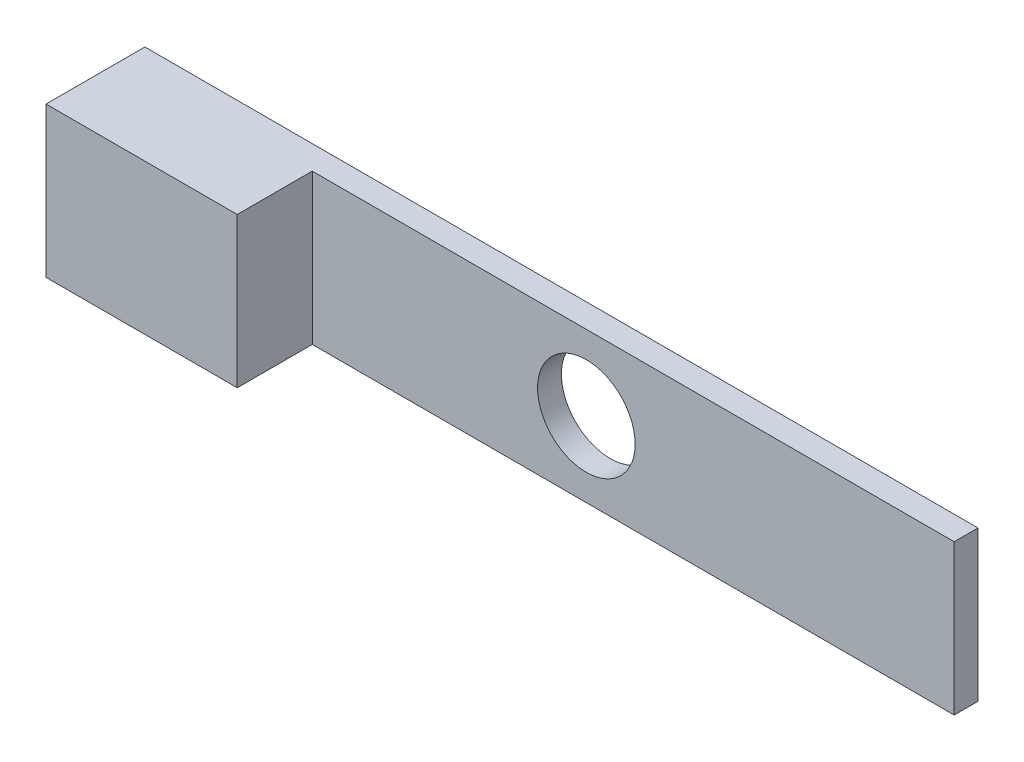
ISO-10303-21;
HEADER;
FILE_DESCRIPTION(('STEP AP214'),'2;1');
FILE_NAME('part.step','',(''),(''),'','','');
FILE_SCHEMA(('AUTOMOTIVE_DESIGN { 1 0 10303 214 1 1 1 1 }'));
ENDSEC;
DATA;
#1=APPLICATION_CONTEXT('core data for automotive mechanical design processes');
#2=APPLICATION_PROTOCOL_DEFINITION('international standard','automotive_design',2000,#1);
#3=PRODUCT_CONTEXT('',#1,'mechanical');
#4=PRODUCT('Part','Part','',(#3));
#5=PRODUCT_RELATED_PRODUCT_CATEGORY('part','',(#4));
#6=PRODUCT_DEFINITION_FORMATION('','',#4);
#7=PRODUCT_DEFINITION_CONTEXT('part definition',#1,'design');
#8=PRODUCT_DEFINITION('design','',#6,#7);
#9=PRODUCT_DEFINITION_SHAPE('','',#8);
#10=(LENGTH_UNIT() NAMED_UNIT(*) SI_UNIT(.MILLI.,.METRE.));
#11=(NAMED_UNIT(*) PLANE_ANGLE_UNIT() SI_UNIT($,.RADIAN.));
#12=(NAMED_UNIT(*) SI_UNIT($,.STERADIAN.) SOLID_ANGLE_UNIT());
#13=UNCERTAINTY_MEASURE_WITH_UNIT(LENGTH_MEASURE(1.E-05),#10,'distance_accuracy_value','');
#14=(GEOMETRIC_REPRESENTATION_CONTEXT(3) GLOBAL_UNCERTAINTY_ASSIGNED_CONTEXT((#13)) GLOBAL_UNIT_ASSIGNED_CONTEXT((#10,
#11,#12)) REPRESENTATION_CONTEXT('',''));
#15=CARTESIAN_POINT('',(0.,0.,0.));
#16=DIRECTION('',(0.,0.,1.));
#17=DIRECTION('',(1.,0.,0.));
#18=AXIS2_PLACEMENT_3D('',#15,#16,#17);
#19=CARTESIAN_POINT('',(-112.538661647429,0.,1.5875));
#20=DIRECTION('',(-1.,0.,0.));
#21=DIRECTION('',(0.,0.,1.));
#22=AXIS2_PLACEMENT_3D('',#19,#20,#21);
#23=PLANE('',#22);
#24=DIRECTION('',(0.,1.,0.));
#25=VECTOR('',#24,1.);
#26=CARTESIAN_POINT('',(-112.538661647429,0.,-1.5875));
#27=LINE('',#26,#25);
#28=CARTESIAN_POINT('',(-112.538661647429,-10.,-1.5875));
#29=VERTEX_POINT('',#28);
#30=CARTESIAN_POINT('',(-112.538661647429,10.,-1.5875));
#31=VERTEX_POINT('',#30);
#32=EDGE_CURVE('E87',#29,#31,#27,.T.);
#33=ORIENTED_EDGE('',*,*,#32,.F.);
#34=DIRECTION('',(0.,0.,-1.));
#35=VECTOR('',#34,1.);
#36=CARTESIAN_POINT('',(-112.538661647429,-10.,1.5875));
#37=LINE('',#36,#35);
#38=CARTESIAN_POINT('',(-112.538661647429,-10.,11.5875));
#39=VERTEX_POINT('',#38);
#40=EDGE_CURVE('E11',#39,#29,#37,.T.);
#41=ORIENTED_EDGE('',*,*,#40,.F.);
#42=DIRECTION('',(0.,-1.,0.));
#43=VECTOR('',#42,1.);
#44=CARTESIAN_POINT('',(-112.538661647429,10.,11.5875));
#45=LINE('',#44,#43);
#46=CARTESIAN_POINT('',(-112.538661647429,10.,11.5875));
#47=VERTEX_POINT('',#46);
#48=EDGE_CURVE('E89',#47,#39,#45,.T.);
#49=ORIENTED_EDGE('',*,*,#48,.F.);
#50=DIRECTION('',(0.,0.,-1.));
#51=VECTOR('',#50,1.);
#52=CARTESIAN_POINT('',(-112.538661647429,10.,1.5875));
#53=LINE('',#52,#51);
#54=EDGE_CURVE('E84',#47,#31,#53,.T.);
#55=ORIENTED_EDGE('',*,*,#54,.T.);
#56=EDGE_LOOP('',(#33,#41,#49,#55));
#57=FACE_BOUND('',#56,.T.);
#58=ADVANCED_FACE('F43',(#57),#23,.T.);
#59=CARTESIAN_POINT('',(0.,-10.,1.5875));
#60=DIRECTION('',(0.,1.,0.));
#61=DIRECTION('',(0.,0.,1.));
#62=AXIS2_PLACEMENT_3D('',#59,#60,#61);
#63=PLANE('',#62);
#64=DIRECTION('',(1.,0.,0.));
#65=VECTOR('',#64,1.);
#66=CARTESIAN_POINT('',(0.,-10.,-1.5875));
#67=LINE('',#66,#65);
#68=CARTESIAN_POINT('',(-1.52509969367723,-10.,-1.5875));
#69=VERTEX_POINT('',#68);
#70=EDGE_CURVE('E102',#29,#69,#67,.T.);
#71=ORIENTED_EDGE('',*,*,#70,.T.);
#72=DIRECTION('',(0.,0.,-1.));
#73=VECTOR('',#72,1.);
#74=CARTESIAN_POINT('',(-1.52509969367723,-10.,1.5875));
#75=LINE('',#74,#73);
#76=CARTESIAN_POINT('',(-1.52509969367723,-10.,1.5875));
#77=VERTEX_POINT('',#76);
#78=EDGE_CURVE('E51',#77,#69,#75,.T.);
#79=ORIENTED_EDGE('',*,*,#78,.F.);
#80=DIRECTION('',(1.,0.,0.));
#81=VECTOR('',#80,1.);
#82=CARTESIAN_POINT('',(0.,-10.,1.5875));
#83=LINE('',#82,#81);
#84=CARTESIAN_POINT('',(-87.0556314820993,-10.,1.5875));
#85=VERTEX_POINT('',#84);
#86=EDGE_CURVE('E110',#85,#77,#83,.T.);
#87=ORIENTED_EDGE('',*,*,#86,.F.);
#88=DIRECTION('',(0.,0.,-1.));
#89=VECTOR('',#88,1.);
#90=CARTESIAN_POINT('',(-87.0556314820993,-10.,11.5875));
#91=LINE('',#90,#89);
#92=CARTESIAN_POINT('',(-87.0556314820993,-10.,11.5875));
#93=VERTEX_POINT('',#92);
#94=EDGE_CURVE('E142',#93,#85,#91,.T.);
#95=ORIENTED_EDGE('',*,*,#94,.F.);
#96=DIRECTION('',(1.,0.,0.));
#97=VECTOR('',#96,1.);
#98=CARTESIAN_POINT('',(-112.538661647429,-10.,11.5875));
#99=LINE('',#98,#97);
#100=EDGE_CURVE('E160',#39,#93,#99,.T.);
#101=ORIENTED_EDGE('',*,*,#100,.F.);
#102=ORIENTED_EDGE('',*,*,#40,.T.);
#103=EDGE_LOOP('',(#71,#79,#87,#95,#101,#102));
#104=FACE_BOUND('',#103,.T.);
#105=ADVANCED_FACE('F128',(#104),#63,.F.);
#106=CARTESIAN_POINT('',(-1.52509969367723,0.,1.5875));
#107=DIRECTION('',(-1.,0.,0.));
#108=DIRECTION('',(0.,0.,1.));
#109=AXIS2_PLACEMENT_3D('',#106,#107,#108);
#110=PLANE('',#109);
#111=DIRECTION('',(0.,1.,0.));
#112=VECTOR('',#111,1.);
#113=CARTESIAN_POINT('',(-1.52509969367723,0.,-1.5875));
#114=LINE('',#113,#112);
#115=CARTESIAN_POINT('',(-1.52509969367723,10.,-1.5875));
#116=VERTEX_POINT('',#115);
#117=EDGE_CURVE('E111',#69,#116,#114,.T.);
#118=ORIENTED_EDGE('',*,*,#117,.T.);
#119=DIRECTION('',(0.,0.,-1.));
#120=VECTOR('',#119,1.);
#121=CARTESIAN_POINT('',(-1.52509969367723,10.,1.5875));
#122=LINE('',#121,#120);
#123=CARTESIAN_POINT('',(-1.52509969367723,10.,1.5875));
#124=VERTEX_POINT('',#123);
#125=EDGE_CURVE('E94',#124,#116,#122,.T.);
#126=ORIENTED_EDGE('',*,*,#125,.F.);
#127=DIRECTION('',(0.,1.,0.));
#128=VECTOR('',#127,1.);
#129=CARTESIAN_POINT('',(-1.52509969367723,0.,1.5875));
#130=LINE('',#129,#128);
#131=EDGE_CURVE('E115',#77,#124,#130,.T.);
#132=ORIENTED_EDGE('',*,*,#131,.F.);
#133=ORIENTED_EDGE('',*,*,#78,.T.);
#134=EDGE_LOOP('',(#118,#126,#132,#133));
#135=FACE_BOUND('',#134,.T.);
#136=ADVANCED_FACE('F126',(#135),#110,.F.);
#137=CARTESIAN_POINT('',(0.,10.,1.5875));
#138=DIRECTION('',(0.,1.,0.));
#139=DIRECTION('',(0.,0.,1.));
#140=AXIS2_PLACEMENT_3D('',#137,#138,#139);
#141=PLANE('',#140);
#142=DIRECTION('',(1.,0.,0.));
#143=VECTOR('',#142,1.);
#144=CARTESIAN_POINT('',(0.,10.,-1.5875));
#145=LINE('',#144,#143);
#146=EDGE_CURVE('E101',#31,#116,#145,.T.);
#147=ORIENTED_EDGE('',*,*,#146,.F.);
#148=ORIENTED_EDGE('',*,*,#54,.F.);
#149=DIRECTION('',(-1.,0.,0.));
#150=VECTOR('',#149,1.);
#151=CARTESIAN_POINT('',(-112.538661647429,10.,11.5875));
#152=LINE('',#151,#150);
#153=CARTESIAN_POINT('',(-87.0556314820993,10.,11.5875));
#154=VERTEX_POINT('',#153);
#155=EDGE_CURVE('E151',#154,#47,#152,.T.);
#156=ORIENTED_EDGE('',*,*,#155,.F.);
#157=DIRECTION('',(0.,0.,-1.));
#158=VECTOR('',#157,1.);
#159=CARTESIAN_POINT('',(-87.0556314820993,10.,11.5875));
#160=LINE('',#159,#158);
#161=CARTESIAN_POINT('',(-87.0556314820993,10.,1.5875));
#162=VERTEX_POINT('',#161);
#163=EDGE_CURVE('E148',#154,#162,#160,.T.);
#164=ORIENTED_EDGE('',*,*,#163,.T.);
#165=DIRECTION('',(1.,0.,0.));
#166=VECTOR('',#165,1.);
#167=CARTESIAN_POINT('',(0.,10.,1.5875));
#168=LINE('',#167,#166);
#169=EDGE_CURVE('E66',#162,#124,#168,.T.);
#170=ORIENTED_EDGE('',*,*,#169,.T.);
#171=ORIENTED_EDGE('',*,*,#125,.T.);
#172=EDGE_LOOP('',(#147,#148,#156,#164,#170,#171));
#173=FACE_BOUND('',#172,.T.);
#174=ADVANCED_FACE('F106',(#173),#141,.T.);
#175=CARTESIAN_POINT('',(0.,0.,1.5875));
#176=DIRECTION('',(0.,0.,1.));
#177=DIRECTION('',(1.,0.,0.));
#178=AXIS2_PLACEMENT_3D('',#175,#176,#177);
#179=PLANE('',#178);
#180=DIRECTION('',(0.,1.,0.));
#181=VECTOR('',#180,1.);
#182=CARTESIAN_POINT('',(-87.0556314820993,10.,1.5875));
#183=LINE('',#182,#181);
#184=EDGE_CURVE('E58',#85,#162,#183,.T.);
#185=ORIENTED_EDGE('',*,*,#184,.F.);
#186=ORIENTED_EDGE('',*,*,#86,.T.);
#187=ORIENTED_EDGE('',*,*,#131,.T.);
#188=ORIENTED_EDGE('',*,*,#169,.F.);
#189=EDGE_LOOP('',(#185,#186,#187,#188));
#190=FACE_BOUND('',#189,.T.);
#191=CARTESIAN_POINT('',(-50.5386616474292,0.,1.5875));
#192=DIRECTION('',(0.,0.,1.));
#193=DIRECTION('',(1.,0.,0.));
#194=AXIS2_PLACEMENT_3D('',#191,#192,#193);
#195=CIRCLE('',#194,6.5);
#196=CARTESIAN_POINT('',(-44.0386616474292,0.,1.5875));
#197=VERTEX_POINT('',#196);
#198=EDGE_CURVE('E138',#197,#197,#195,.T.);
#199=ORIENTED_EDGE('',*,*,#198,.F.);
#200=EDGE_LOOP('',(#199));
#201=FACE_BOUND('',#200,.T.);
#202=ADVANCED_FACE('F200',(#190,#201),#179,.T.);
#203=CARTESIAN_POINT('',(0.,0.,-1.5875));
#204=DIRECTION('',(0.,0.,1.));
#205=DIRECTION('',(1.,0.,0.));
#206=AXIS2_PLACEMENT_3D('',#203,#204,#205);
#207=PLANE('',#206);
#208=CARTESIAN_POINT('',(-50.5386616474292,0.,-1.5875));
#209=DIRECTION('',(0.,0.,1.));
#210=DIRECTION('',(1.,0.,0.));
#211=AXIS2_PLACEMENT_3D('',#208,#209,#210);
#212=CIRCLE('',#211,6.5);
#213=CARTESIAN_POINT('',(-44.0386616474292,0.,-1.5875));
#214=VERTEX_POINT('',#213);
#215=EDGE_CURVE('E104',#214,#214,#212,.T.);
#216=ORIENTED_EDGE('',*,*,#215,.T.);
#217=EDGE_LOOP('',(#216));
#218=FACE_BOUND('',#217,.T.);
#219=ORIENTED_EDGE('',*,*,#32,.T.);
#220=ORIENTED_EDGE('',*,*,#146,.T.);
#221=ORIENTED_EDGE('',*,*,#117,.F.);
#222=ORIENTED_EDGE('',*,*,#70,.F.);
#223=EDGE_LOOP('',(#219,#220,#221,#222));
#224=FACE_BOUND('',#223,.T.);
#225=ADVANCED_FACE('F99',(#218,#224),#207,.F.);
#226=CARTESIAN_POINT('',(-50.5386616474292,0.,-1.5875));
#227=DIRECTION('',(0.,0.,1.));
#228=DIRECTION('',(1.,0.,0.));
#229=AXIS2_PLACEMENT_3D('',#226,#227,#228);
#230=CYLINDRICAL_SURFACE('',#229,6.5);
#231=ORIENTED_EDGE('',*,*,#215,.F.);
#232=EDGE_LOOP('',(#231));
#233=FACE_BOUND('',#232,.T.);
#234=ORIENTED_EDGE('',*,*,#198,.T.);
#235=EDGE_LOOP('',(#234));
#236=FACE_BOUND('',#235,.T.);
#237=ADVANCED_FACE('F180',(#233,#236),#230,.F.);
#238=CARTESIAN_POINT('',(-87.0556314820993,10.,11.5875));
#239=DIRECTION('',(-1.,0.,0.));
#240=DIRECTION('',(0.,0.,1.));
#241=AXIS2_PLACEMENT_3D('',#238,#239,#240);
#242=PLANE('',#241);
#243=ORIENTED_EDGE('',*,*,#184,.T.);
#244=ORIENTED_EDGE('',*,*,#163,.F.);
#245=DIRECTION('',(0.,1.,0.));
#246=VECTOR('',#245,1.);
#247=CARTESIAN_POINT('',(-87.0556314820993,10.,11.5875));
#248=LINE('',#247,#246);
#249=EDGE_CURVE('E156',#93,#154,#248,.T.);
#250=ORIENTED_EDGE('',*,*,#249,.F.);
#251=ORIENTED_EDGE('',*,*,#94,.T.);
#252=EDGE_LOOP('',(#243,#244,#250,#251));
#253=FACE_BOUND('',#252,.T.);
#254=ADVANCED_FACE('F178',(#253),#242,.F.);
#255=CARTESIAN_POINT('',(0.,0.,11.5875));
#256=DIRECTION('',(0.,0.,1.));
#257=DIRECTION('',(1.,0.,0.));
#258=AXIS2_PLACEMENT_3D('',#255,#256,#257);
#259=PLANE('',#258);
#260=ORIENTED_EDGE('',*,*,#48,.T.);
#261=ORIENTED_EDGE('',*,*,#100,.T.);
#262=ORIENTED_EDGE('',*,*,#249,.T.);
#263=ORIENTED_EDGE('',*,*,#155,.T.);
#264=EDGE_LOOP('',(#260,#261,#262,#263));
#265=FACE_BOUND('',#264,.T.);
#266=ADVANCED_FACE('F167',(#265),#259,.T.);
#267=CLOSED_SHELL('',(#58,#105,#136,#174,#202,#225,#237,#254,#266));
#268=MANIFOLD_SOLID_BREP('B2',#267);
#269=ADVANCED_BREP_SHAPE_REPRESENTATION('',(#18,#268),#14);
#270=SHAPE_DEFINITION_REPRESENTATION(#9,#269);
ENDSEC;
END-ISO-10303-21;
